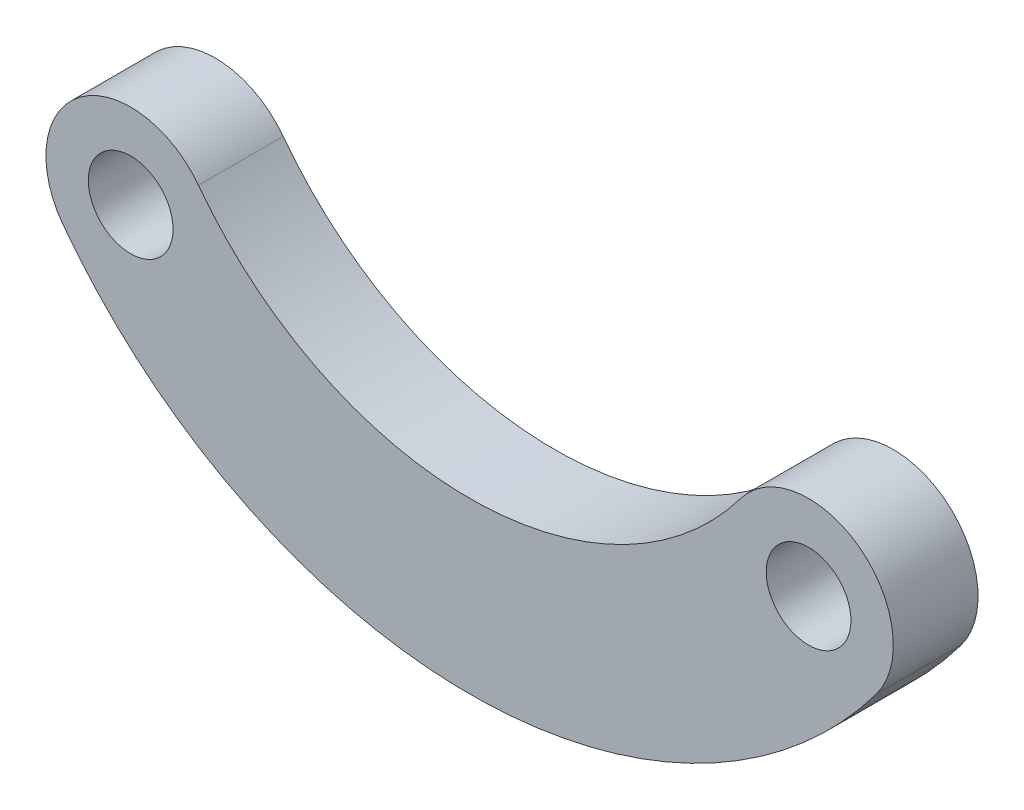
ISO-10303-21;
HEADER;
FILE_DESCRIPTION(('STEP AP214'),'2;1');
FILE_NAME('part.step','',(''),(''),'','','');
FILE_SCHEMA(('AUTOMOTIVE_DESIGN { 1 0 10303 214 1 1 1 1 }'));
ENDSEC;
DATA;
#1=APPLICATION_CONTEXT('core data for automotive mechanical design processes');
#2=APPLICATION_PROTOCOL_DEFINITION('international standard','automotive_design',2000,#1);
#3=PRODUCT_CONTEXT('',#1,'mechanical');
#4=PRODUCT('Part','Part','',(#3));
#5=PRODUCT_RELATED_PRODUCT_CATEGORY('part','',(#4));
#6=PRODUCT_DEFINITION_FORMATION('','',#4);
#7=PRODUCT_DEFINITION_CONTEXT('part definition',#1,'design');
#8=PRODUCT_DEFINITION('design','',#6,#7);
#9=PRODUCT_DEFINITION_SHAPE('','',#8);
#10=(LENGTH_UNIT() NAMED_UNIT(*) SI_UNIT(.MILLI.,.METRE.));
#11=(NAMED_UNIT(*) PLANE_ANGLE_UNIT() SI_UNIT($,.RADIAN.));
#12=(NAMED_UNIT(*) SI_UNIT($,.STERADIAN.) SOLID_ANGLE_UNIT());
#13=UNCERTAINTY_MEASURE_WITH_UNIT(LENGTH_MEASURE(1.E-05),#10,'distance_accuracy_value','');
#14=(GEOMETRIC_REPRESENTATION_CONTEXT(3) GLOBAL_UNCERTAINTY_ASSIGNED_CONTEXT((#13)) GLOBAL_UNIT_ASSIGNED_CONTEXT((#10,
#11,#12)) REPRESENTATION_CONTEXT('',''));
#15=CARTESIAN_POINT('',(0.,0.,0.));
#16=DIRECTION('',(0.,0.,1.));
#17=DIRECTION('',(1.,0.,0.));
#18=AXIS2_PLACEMENT_3D('',#15,#16,#17);
#19=CARTESIAN_POINT('',(5.08,3.81,2.54));
#20=DIRECTION('',(0.,0.,1.));
#21=DIRECTION('',(1.,0.,0.));
#22=AXIS2_PLACEMENT_3D('',#19,#20,#21);
#23=PLANE('',#22);
#24=CARTESIAN_POINT('',(0.,0.,2.54));
#25=DIRECTION('',(0.,0.,1.));
#26=DIRECTION('',(1.,0.,0.));
#27=AXIS2_PLACEMENT_3D('',#24,#25,#26);
#28=CIRCLE('',#27,1.27);
#29=CARTESIAN_POINT('',(1.27,0.,2.54));
#30=VERTEX_POINT('',#29);
#31=EDGE_CURVE('E100',#30,#30,#28,.T.);
#32=ORIENTED_EDGE('',*,*,#31,.F.);
#33=EDGE_LOOP('',(#32));
#34=FACE_BOUND('',#33,.T.);
#35=CARTESIAN_POINT('',(0.,0.,2.54));
#36=DIRECTION('',(0.,0.,1.));
#37=DIRECTION('',(1.,0.,0.));
#38=AXIS2_PLACEMENT_3D('',#35,#36,#37);
#39=CIRCLE('',#38,2.54);
#40=CARTESIAN_POINT('',(2.032,1.52400000000001,2.54));
#41=VERTEX_POINT('',#40);
#42=CARTESIAN_POINT('',(-2.032,-1.524,2.54));
#43=VERTEX_POINT('',#42);
#44=EDGE_CURVE('E85',#41,#43,#39,.T.);
#45=ORIENTED_EDGE('',*,*,#44,.T.);
#46=CARTESIAN_POINT('',(10.16,7.62,2.54));
#47=DIRECTION('',(0.,0.,1.));
#48=DIRECTION('',(1.,0.,0.));
#49=AXIS2_PLACEMENT_3D('',#46,#47,#48);
#50=CIRCLE('',#49,15.24);
#51=CARTESIAN_POINT('',(22.352,-1.524,2.54));
#52=VERTEX_POINT('',#51);
#53=EDGE_CURVE('E80',#43,#52,#50,.T.);
#54=ORIENTED_EDGE('',*,*,#53,.T.);
#55=CARTESIAN_POINT('',(20.32,0.,2.54));
#56=DIRECTION('',(0.,0.,1.));
#57=DIRECTION('',(1.,0.,0.));
#58=AXIS2_PLACEMENT_3D('',#55,#56,#57);
#59=CIRCLE('',#58,2.54);
#60=CARTESIAN_POINT('',(18.288,1.524,2.54));
#61=VERTEX_POINT('',#60);
#62=EDGE_CURVE('E83',#52,#61,#59,.T.);
#63=ORIENTED_EDGE('',*,*,#62,.T.);
#64=CARTESIAN_POINT('',(10.16,7.62,2.54));
#65=DIRECTION('',(0.,0.,-1.));
#66=DIRECTION('',(1.,0.,0.));
#67=AXIS2_PLACEMENT_3D('',#64,#65,#66);
#68=CIRCLE('',#67,10.16);
#69=EDGE_CURVE('E50',#61,#41,#68,.T.);
#70=ORIENTED_EDGE('',*,*,#69,.T.);
#71=EDGE_LOOP('',(#45,#54,#63,#70));
#72=FACE_BOUND('',#71,.T.);
#73=CARTESIAN_POINT('',(20.32,0.,2.54));
#74=DIRECTION('',(0.,0.,1.));
#75=DIRECTION('',(1.,0.,0.));
#76=AXIS2_PLACEMENT_3D('',#73,#74,#75);
#77=CIRCLE('',#76,1.27);
#78=CARTESIAN_POINT('',(21.59,0.,2.54));
#79=VERTEX_POINT('',#78);
#80=EDGE_CURVE('E115',#79,#79,#77,.T.);
#81=ORIENTED_EDGE('',*,*,#80,.F.);
#82=EDGE_LOOP('',(#81));
#83=FACE_BOUND('',#82,.T.);
#84=ADVANCED_FACE('F33',(#34,#72,#83),#23,.T.);
#85=CARTESIAN_POINT('',(5.08,3.81,0.));
#86=DIRECTION('',(0.,0.,1.));
#87=DIRECTION('',(1.,0.,0.));
#88=AXIS2_PLACEMENT_3D('',#85,#86,#87);
#89=PLANE('',#88);
#90=CARTESIAN_POINT('',(0.,0.,0.));
#91=DIRECTION('',(0.,0.,1.));
#92=DIRECTION('',(1.,0.,0.));
#93=AXIS2_PLACEMENT_3D('',#90,#91,#92);
#94=CIRCLE('',#93,1.27);
#95=CARTESIAN_POINT('',(1.27,0.,0.));
#96=VERTEX_POINT('',#95);
#97=EDGE_CURVE('E112',#96,#96,#94,.T.);
#98=ORIENTED_EDGE('',*,*,#97,.T.);
#99=EDGE_LOOP('',(#98));
#100=FACE_BOUND('',#99,.T.);
#101=CARTESIAN_POINT('',(0.,0.,0.));
#102=DIRECTION('',(0.,0.,1.));
#103=DIRECTION('',(1.,0.,0.));
#104=AXIS2_PLACEMENT_3D('',#101,#102,#103);
#105=CIRCLE('',#104,2.54);
#106=CARTESIAN_POINT('',(2.032,1.52400000000001,0.));
#107=VERTEX_POINT('',#106);
#108=CARTESIAN_POINT('',(-2.032,-1.524,0.));
#109=VERTEX_POINT('',#108);
#110=EDGE_CURVE('E97',#107,#109,#105,.T.);
#111=ORIENTED_EDGE('',*,*,#110,.F.);
#112=CARTESIAN_POINT('',(10.16,7.62,0.));
#113=DIRECTION('',(0.,0.,-1.));
#114=DIRECTION('',(1.,0.,0.));
#115=AXIS2_PLACEMENT_3D('',#112,#113,#114);
#116=CIRCLE('',#115,10.16);
#117=CARTESIAN_POINT('',(18.288,1.524,0.));
#118=VERTEX_POINT('',#117);
#119=EDGE_CURVE('E73',#118,#107,#116,.T.);
#120=ORIENTED_EDGE('',*,*,#119,.F.);
#121=CARTESIAN_POINT('',(20.32,0.,0.));
#122=DIRECTION('',(0.,0.,1.));
#123=DIRECTION('',(1.,0.,0.));
#124=AXIS2_PLACEMENT_3D('',#121,#122,#123);
#125=CIRCLE('',#124,2.54);
#126=CARTESIAN_POINT('',(22.352,-1.524,0.));
#127=VERTEX_POINT('',#126);
#128=EDGE_CURVE('E67',#127,#118,#125,.T.);
#129=ORIENTED_EDGE('',*,*,#128,.F.);
#130=CARTESIAN_POINT('',(10.16,7.62,0.));
#131=DIRECTION('',(0.,0.,1.));
#132=DIRECTION('',(1.,0.,0.));
#133=AXIS2_PLACEMENT_3D('',#130,#131,#132);
#134=CIRCLE('',#133,15.24);
#135=EDGE_CURVE('E89',#109,#127,#134,.T.);
#136=ORIENTED_EDGE('',*,*,#135,.F.);
#137=EDGE_LOOP('',(#111,#120,#129,#136));
#138=FACE_BOUND('',#137,.T.);
#139=CARTESIAN_POINT('',(20.32,0.,0.));
#140=DIRECTION('',(0.,0.,1.));
#141=DIRECTION('',(1.,0.,0.));
#142=AXIS2_PLACEMENT_3D('',#139,#140,#141);
#143=CIRCLE('',#142,1.27);
#144=CARTESIAN_POINT('',(21.59,0.,0.));
#145=VERTEX_POINT('',#144);
#146=EDGE_CURVE('E118',#145,#145,#143,.T.);
#147=ORIENTED_EDGE('',*,*,#146,.T.);
#148=EDGE_LOOP('',(#147));
#149=FACE_BOUND('',#148,.T.);
#150=ADVANCED_FACE('F108',(#100,#138,#149),#89,.F.);
#151=CARTESIAN_POINT('',(0.,0.,2.54));
#152=DIRECTION('',(0.,0.,-1.));
#153=DIRECTION('',(-1.,0.,0.));
#154=AXIS2_PLACEMENT_3D('',#151,#152,#153);
#155=CYLINDRICAL_SURFACE('',#154,2.54);
#156=ORIENTED_EDGE('',*,*,#110,.T.);
#157=DIRECTION('',(0.,0.,-1.));
#158=VECTOR('',#157,1.);
#159=CARTESIAN_POINT('',(-2.032,-1.524,2.54));
#160=LINE('',#159,#158);
#161=EDGE_CURVE('E11',#43,#109,#160,.T.);
#162=ORIENTED_EDGE('',*,*,#161,.F.);
#163=ORIENTED_EDGE('',*,*,#44,.F.);
#164=DIRECTION('',(0.,0.,-1.));
#165=VECTOR('',#164,1.);
#166=CARTESIAN_POINT('',(2.032,1.52400000000001,2.54));
#167=LINE('',#166,#165);
#168=EDGE_CURVE('E93',#41,#107,#167,.T.);
#169=ORIENTED_EDGE('',*,*,#168,.T.);
#170=EDGE_LOOP('',(#156,#162,#163,#169));
#171=FACE_BOUND('',#170,.T.);
#172=ADVANCED_FACE('F35',(#171),#155,.T.);
#173=CARTESIAN_POINT('',(10.16,7.62,2.54));
#174=DIRECTION('',(0.,0.,-1.));
#175=DIRECTION('',(-1.,0.,0.));
#176=AXIS2_PLACEMENT_3D('',#173,#174,#175);
#177=CYLINDRICAL_SURFACE('',#176,15.24);
#178=ORIENTED_EDGE('',*,*,#135,.T.);
#179=DIRECTION('',(0.,0.,-1.));
#180=VECTOR('',#179,1.);
#181=CARTESIAN_POINT('',(22.352,-1.524,2.54));
#182=LINE('',#181,#180);
#183=EDGE_CURVE('E42',#52,#127,#182,.T.);
#184=ORIENTED_EDGE('',*,*,#183,.F.);
#185=ORIENTED_EDGE('',*,*,#53,.F.);
#186=ORIENTED_EDGE('',*,*,#161,.T.);
#187=EDGE_LOOP('',(#178,#184,#185,#186));
#188=FACE_BOUND('',#187,.T.);
#189=ADVANCED_FACE('F88',(#188),#177,.T.);
#190=CARTESIAN_POINT('',(20.32,0.,2.54));
#191=DIRECTION('',(0.,0.,-1.));
#192=DIRECTION('',(-1.,0.,0.));
#193=AXIS2_PLACEMENT_3D('',#190,#191,#192);
#194=CYLINDRICAL_SURFACE('',#193,2.54);
#195=ORIENTED_EDGE('',*,*,#128,.T.);
#196=DIRECTION('',(0.,0.,-1.));
#197=VECTOR('',#196,1.);
#198=CARTESIAN_POINT('',(18.288,1.524,2.54));
#199=LINE('',#198,#197);
#200=EDGE_CURVE('E90',#61,#118,#199,.T.);
#201=ORIENTED_EDGE('',*,*,#200,.F.);
#202=ORIENTED_EDGE('',*,*,#62,.F.);
#203=ORIENTED_EDGE('',*,*,#183,.T.);
#204=EDGE_LOOP('',(#195,#201,#202,#203));
#205=FACE_BOUND('',#204,.T.);
#206=ADVANCED_FACE('F91',(#205),#194,.T.);
#207=CARTESIAN_POINT('',(10.16,7.62,2.54));
#208=DIRECTION('',(0.,0.,-1.));
#209=DIRECTION('',(-1.,0.,0.));
#210=AXIS2_PLACEMENT_3D('',#207,#208,#209);
#211=CYLINDRICAL_SURFACE('',#210,10.16);
#212=ORIENTED_EDGE('',*,*,#119,.T.);
#213=ORIENTED_EDGE('',*,*,#168,.F.);
#214=ORIENTED_EDGE('',*,*,#69,.F.);
#215=ORIENTED_EDGE('',*,*,#200,.T.);
#216=EDGE_LOOP('',(#212,#213,#214,#215));
#217=FACE_BOUND('',#216,.T.);
#218=ADVANCED_FACE('F105',(#217),#211,.F.);
#219=CARTESIAN_POINT('',(0.,0.,2.54));
#220=DIRECTION('',(0.,0.,-1.));
#221=DIRECTION('',(-1.,0.,0.));
#222=AXIS2_PLACEMENT_3D('',#219,#220,#221);
#223=CYLINDRICAL_SURFACE('',#222,1.27);
#224=ORIENTED_EDGE('',*,*,#31,.T.);
#225=EDGE_LOOP('',(#224));
#226=FACE_BOUND('',#225,.T.);
#227=ORIENTED_EDGE('',*,*,#97,.F.);
#228=EDGE_LOOP('',(#227));
#229=FACE_BOUND('',#228,.T.);
#230=ADVANCED_FACE('F136',(#226,#229),#223,.F.);
#231=CARTESIAN_POINT('',(20.32,0.,2.54));
#232=DIRECTION('',(0.,0.,-1.));
#233=DIRECTION('',(-1.,0.,0.));
#234=AXIS2_PLACEMENT_3D('',#231,#232,#233);
#235=CYLINDRICAL_SURFACE('',#234,1.27);
#236=ORIENTED_EDGE('',*,*,#80,.T.);
#237=EDGE_LOOP('',(#236));
#238=FACE_BOUND('',#237,.T.);
#239=ORIENTED_EDGE('',*,*,#146,.F.);
#240=EDGE_LOOP('',(#239));
#241=FACE_BOUND('',#240,.T.);
#242=ADVANCED_FACE('F124',(#238,#241),#235,.F.);
#243=CLOSED_SHELL('',(#84,#150,#172,#189,#206,#218,#230,#242));
#244=MANIFOLD_SOLID_BREP('B2',#243);
#245=ADVANCED_BREP_SHAPE_REPRESENTATION('',(#18,#244),#14);
#246=SHAPE_DEFINITION_REPRESENTATION(#9,#245);
ENDSEC;
END-ISO-10303-21;
